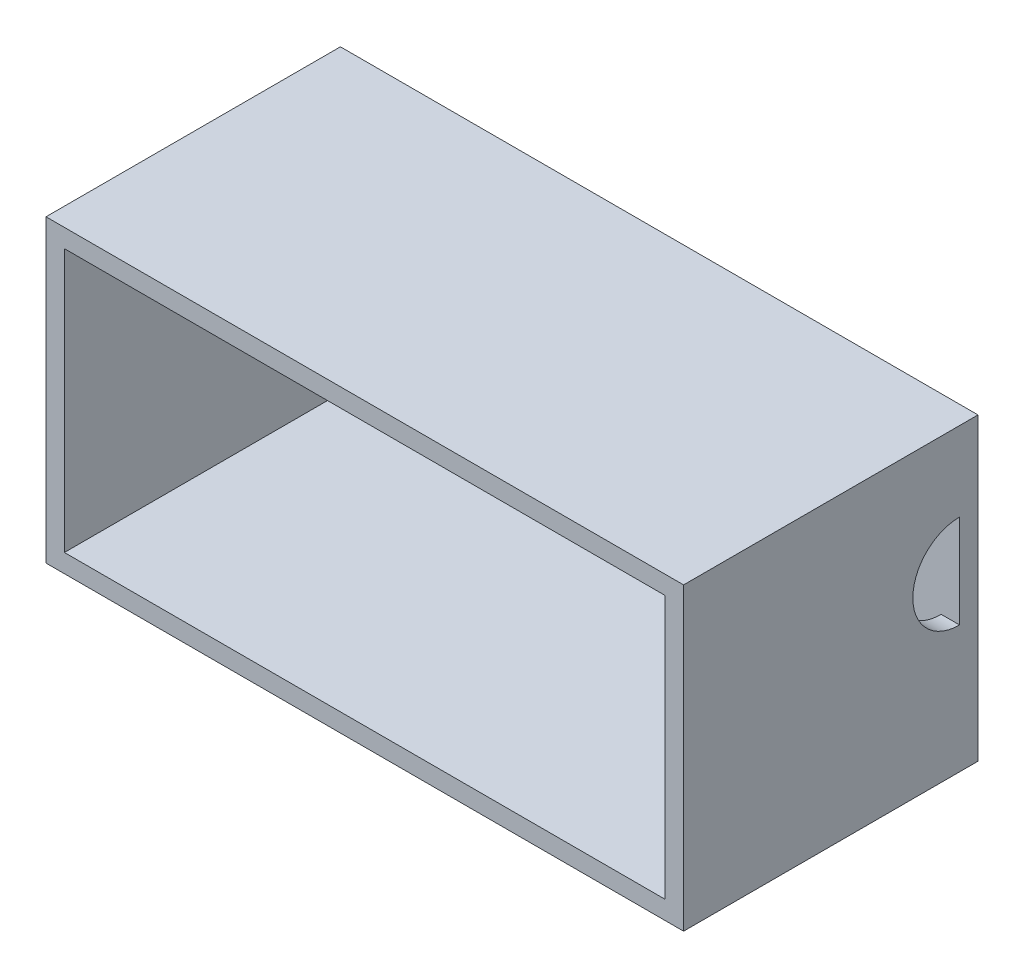
ISO-10303-21;
HEADER;
FILE_DESCRIPTION(('STEP AP214'),'2;1');
FILE_NAME('part.step','',(''),(''),'','','');
FILE_SCHEMA(('AUTOMOTIVE_DESIGN { 1 0 10303 214 1 1 1 1 }'));
ENDSEC;
DATA;
#1=APPLICATION_CONTEXT('core data for automotive mechanical design processes');
#2=APPLICATION_PROTOCOL_DEFINITION('international standard','automotive_design',2000,#1);
#3=PRODUCT_CONTEXT('',#1,'mechanical');
#4=PRODUCT('Part','Part','',(#3));
#5=PRODUCT_RELATED_PRODUCT_CATEGORY('part','',(#4));
#6=PRODUCT_DEFINITION_FORMATION('','',#4);
#7=PRODUCT_DEFINITION_CONTEXT('part definition',#1,'design');
#8=PRODUCT_DEFINITION('design','',#6,#7);
#9=PRODUCT_DEFINITION_SHAPE('','',#8);
#10=(LENGTH_UNIT() NAMED_UNIT(*) SI_UNIT(.MILLI.,.METRE.));
#11=(NAMED_UNIT(*) PLANE_ANGLE_UNIT() SI_UNIT($,.RADIAN.));
#12=(NAMED_UNIT(*) SI_UNIT($,.STERADIAN.) SOLID_ANGLE_UNIT());
#13=UNCERTAINTY_MEASURE_WITH_UNIT(LENGTH_MEASURE(1.E-05),#10,'distance_accuracy_value','');
#14=(GEOMETRIC_REPRESENTATION_CONTEXT(3) GLOBAL_UNCERTAINTY_ASSIGNED_CONTEXT((#13)) GLOBAL_UNIT_ASSIGNED_CONTEXT((#10,
#11,#12)) REPRESENTATION_CONTEXT('',''));
#15=CARTESIAN_POINT('',(0.,0.,0.));
#16=DIRECTION('',(0.,0.,1.));
#17=DIRECTION('',(1.,0.,0.));
#18=AXIS2_PLACEMENT_3D('',#15,#16,#17);
#19=CARTESIAN_POINT('',(0.,0.,30.));
#20=DIRECTION('',(0.,0.,1.));
#21=DIRECTION('',(1.,0.,0.));
#22=AXIS2_PLACEMENT_3D('',#19,#20,#21);
#23=PLANE('',#22);
#24=DIRECTION('',(0.,-1.,0.));
#25=VECTOR('',#24,1.);
#26=CARTESIAN_POINT('',(-26.415547341068,11.723595505618,30.));
#27=LINE('',#26,#25);
#28=CARTESIAN_POINT('',(-26.415547341068,11.723595505618,30.));
#29=VERTEX_POINT('',#28);
#30=CARTESIAN_POINT('',(-26.415547341068,-20.8764044943821,30.));
#31=VERTEX_POINT('',#30);
#32=EDGE_CURVE('E169',#29,#31,#27,.T.);
#33=ORIENTED_EDGE('',*,*,#32,.T.);
#34=DIRECTION('',(1.,0.,0.));
#35=VECTOR('',#34,1.);
#36=CARTESIAN_POINT('',(-26.415547341068,-20.8764044943821,30.));
#37=LINE('',#36,#35);
#38=CARTESIAN_POINT('',(42.884452658932,-20.8764044943821,30.));
#39=VERTEX_POINT('',#38);
#40=EDGE_CURVE('E172',#31,#39,#37,.T.);
#41=ORIENTED_EDGE('',*,*,#40,.T.);
#42=DIRECTION('',(0.,1.,0.));
#43=VECTOR('',#42,1.);
#44=CARTESIAN_POINT('',(42.884452658932,11.723595505618,30.));
#45=LINE('',#44,#43);
#46=CARTESIAN_POINT('',(42.884452658932,11.723595505618,30.));
#47=VERTEX_POINT('',#46);
#48=EDGE_CURVE('E174',#39,#47,#45,.T.);
#49=ORIENTED_EDGE('',*,*,#48,.T.);
#50=DIRECTION('',(-1.,0.,0.));
#51=VECTOR('',#50,1.);
#52=CARTESIAN_POINT('',(-26.415547341068,11.723595505618,30.));
#53=LINE('',#52,#51);
#54=EDGE_CURVE('E176',#47,#29,#53,.T.);
#55=ORIENTED_EDGE('',*,*,#54,.T.);
#56=EDGE_LOOP('',(#33,#41,#49,#55));
#57=FACE_BOUND('',#56,.T.);
#58=DIRECTION('',(1.,0.,0.));
#59=VECTOR('',#58,1.);
#60=CARTESIAN_POINT('',(-24.415547341068,-18.876404494382,30.));
#61=LINE('',#60,#59);
#62=CARTESIAN_POINT('',(-24.415547341068,-18.876404494382,30.));
#63=VERTEX_POINT('',#62);
#64=CARTESIAN_POINT('',(40.884452658932,-18.876404494382,30.));
#65=VERTEX_POINT('',#64);
#66=EDGE_CURVE('E215',#63,#65,#61,.T.);
#67=ORIENTED_EDGE('',*,*,#66,.F.);
#68=DIRECTION('',(0.,-1.,0.));
#69=VECTOR('',#68,1.);
#70=CARTESIAN_POINT('',(-24.415547341068,9.72359550561795,30.));
#71=LINE('',#70,#69);
#72=CARTESIAN_POINT('',(-24.415547341068,9.72359550561795,30.));
#73=VERTEX_POINT('',#72);
#74=EDGE_CURVE('E154',#73,#63,#71,.T.);
#75=ORIENTED_EDGE('',*,*,#74,.F.);
#76=DIRECTION('',(-1.,0.,0.));
#77=VECTOR('',#76,1.);
#78=CARTESIAN_POINT('',(-24.415547341068,9.72359550561795,30.));
#79=LINE('',#78,#77);
#80=CARTESIAN_POINT('',(40.884452658932,9.72359550561796,30.));
#81=VERTEX_POINT('',#80);
#82=EDGE_CURVE('E162',#81,#73,#79,.T.);
#83=ORIENTED_EDGE('',*,*,#82,.F.);
#84=DIRECTION('',(0.,1.,0.));
#85=VECTOR('',#84,1.);
#86=CARTESIAN_POINT('',(40.884452658932,9.72359550561796,30.));
#87=LINE('',#86,#85);
#88=EDGE_CURVE('E217',#65,#81,#87,.T.);
#89=ORIENTED_EDGE('',*,*,#88,.F.);
#90=EDGE_LOOP('',(#67,#75,#83,#89));
#91=FACE_BOUND('',#90,.T.);
#92=ADVANCED_FACE('F33',(#57,#91),#23,.T.);
#93=CARTESIAN_POINT('',(-26.415547341068,11.723595505618,30.));
#94=DIRECTION('',(1.,0.,0.));
#95=DIRECTION('',(0.,1.,0.));
#96=AXIS2_PLACEMENT_3D('',#93,#94,#95);
#97=PLANE('',#96);
#98=DIRECTION('',(0.,0.,-1.));
#99=VECTOR('',#98,1.);
#100=CARTESIAN_POINT('',(-26.415547341068,-13.276404494382,30.));
#101=LINE('',#100,#99);
#102=CARTESIAN_POINT('',(-26.415547341068,-13.276404494382,4.));
#103=VERTEX_POINT('',#102);
#104=CARTESIAN_POINT('',(-26.415547341068,-13.276404494382,0.));
#105=VERTEX_POINT('',#104);
#106=EDGE_CURVE('E207',#103,#105,#101,.T.);
#107=ORIENTED_EDGE('',*,*,#106,.T.);
#108=DIRECTION('',(0.,1.,0.));
#109=VECTOR('',#108,1.);
#110=CARTESIAN_POINT('',(-26.415547341068,11.723595505618,0.));
#111=LINE('',#110,#109);
#112=CARTESIAN_POINT('',(-26.415547341068,-0.276404494382045,0.));
#113=VERTEX_POINT('',#112);
#114=EDGE_CURVE('E204',#105,#113,#111,.T.);
#115=ORIENTED_EDGE('',*,*,#114,.T.);
#116=DIRECTION('',(0.,0.,1.));
#117=VECTOR('',#116,1.);
#118=CARTESIAN_POINT('',(-26.415547341068,-0.276404494382045,30.));
#119=LINE('',#118,#117);
#120=CARTESIAN_POINT('',(-26.415547341068,-0.276404494382045,4.));
#121=VERTEX_POINT('',#120);
#122=EDGE_CURVE('E257',#113,#121,#119,.T.);
#123=ORIENTED_EDGE('',*,*,#122,.T.);
#124=DIRECTION('',(0.,-1.,0.));
#125=VECTOR('',#124,1.);
#126=CARTESIAN_POINT('',(-26.415547341068,11.723595505618,4.));
#127=LINE('',#126,#125);
#128=EDGE_CURVE('E265',#121,#103,#127,.T.);
#129=ORIENTED_EDGE('',*,*,#128,.T.);
#130=EDGE_LOOP('',(#107,#115,#123,#129));
#131=FACE_BOUND('',#130,.T.);
#132=DIRECTION('',(0.,0.,-1.));
#133=VECTOR('',#132,1.);
#134=CARTESIAN_POINT('',(-26.415547341068,11.723595505618,30.));
#135=LINE('',#134,#133);
#136=CARTESIAN_POINT('',(-26.415547341068,11.723595505618,-2.));
#137=VERTEX_POINT('',#136);
#138=EDGE_CURVE('E178',#29,#137,#135,.T.);
#139=ORIENTED_EDGE('',*,*,#138,.T.);
#140=DIRECTION('',(0.,1.,0.));
#141=VECTOR('',#140,1.);
#142=CARTESIAN_POINT('',(-26.415547341068,11.723595505618,-2.));
#143=LINE('',#142,#141);
#144=CARTESIAN_POINT('',(-26.415547341068,-20.8764044943821,-2.));
#145=VERTEX_POINT('',#144);
#146=EDGE_CURVE('E198',#145,#137,#143,.T.);
#147=ORIENTED_EDGE('',*,*,#146,.F.);
#148=DIRECTION('',(0.,0.,-1.));
#149=VECTOR('',#148,1.);
#150=CARTESIAN_POINT('',(-26.415547341068,-20.8764044943821,30.));
#151=LINE('',#150,#149);
#152=EDGE_CURVE('E11',#31,#145,#151,.T.);
#153=ORIENTED_EDGE('',*,*,#152,.F.);
#154=ORIENTED_EDGE('',*,*,#32,.F.);
#155=EDGE_LOOP('',(#139,#147,#153,#154));
#156=FACE_BOUND('',#155,.T.);
#157=ADVANCED_FACE('F35',(#131,#156),#97,.F.);
#158=CARTESIAN_POINT('',(-26.415547341068,-20.8764044943821,30.));
#159=DIRECTION('',(0.,1.,0.));
#160=DIRECTION('',(0.,0.,1.));
#161=AXIS2_PLACEMENT_3D('',#158,#159,#160);
#162=PLANE('',#161);
#163=ORIENTED_EDGE('',*,*,#152,.T.);
#164=DIRECTION('',(-1.,0.,0.));
#165=VECTOR('',#164,1.);
#166=CARTESIAN_POINT('',(42.884452658932,-20.8764044943821,-2.));
#167=LINE('',#166,#165);
#168=CARTESIAN_POINT('',(42.884452658932,-20.8764044943821,-2.));
#169=VERTEX_POINT('',#168);
#170=EDGE_CURVE('E192',#169,#145,#167,.T.);
#171=ORIENTED_EDGE('',*,*,#170,.F.);
#172=DIRECTION('',(0.,0.,-1.));
#173=VECTOR('',#172,1.);
#174=CARTESIAN_POINT('',(42.884452658932,-20.8764044943821,30.));
#175=LINE('',#174,#173);
#176=EDGE_CURVE('E41',#39,#169,#175,.T.);
#177=ORIENTED_EDGE('',*,*,#176,.F.);
#178=ORIENTED_EDGE('',*,*,#40,.F.);
#179=EDGE_LOOP('',(#163,#171,#177,#178));
#180=FACE_BOUND('',#179,.T.);
#181=ADVANCED_FACE('F193',(#180),#162,.F.);
#182=CARTESIAN_POINT('',(42.884452658932,11.723595505618,30.));
#183=DIRECTION('',(-1.,0.,0.));
#184=DIRECTION('',(0.,0.,1.));
#185=AXIS2_PLACEMENT_3D('',#182,#183,#184);
#186=PLANE('',#185);
#187=DIRECTION('',(0.,-1.,0.));
#188=VECTOR('',#187,1.);
#189=CARTESIAN_POINT('',(42.884452658932,11.723595505618,0.));
#190=LINE('',#189,#188);
#191=CARTESIAN_POINT('',(42.884452658932,3.11129412181544,0.));
#192=VERTEX_POINT('',#191);
#193=CARTESIAN_POINT('',(42.884452658932,-7.0522569065563,0.));
#194=VERTEX_POINT('',#193);
#195=EDGE_CURVE('E135',#192,#194,#190,.T.);
#196=ORIENTED_EDGE('',*,*,#195,.T.);
#197=CARTESIAN_POINT('',(42.884452658932,-1.97048139237043,0.));
#198=DIRECTION('',(-1.,0.,0.));
#199=DIRECTION('',(0.,0.,1.));
#200=AXIS2_PLACEMENT_3D('',#197,#198,#199);
#201=CIRCLE('',#200,5.08177551418587);
#202=EDGE_CURVE('E133',#194,#192,#201,.T.);
#203=ORIENTED_EDGE('',*,*,#202,.T.);
#204=EDGE_LOOP('',(#196,#203));
#205=FACE_BOUND('',#204,.T.);
#206=ORIENTED_EDGE('',*,*,#176,.T.);
#207=DIRECTION('',(0.,-1.,0.));
#208=VECTOR('',#207,1.);
#209=CARTESIAN_POINT('',(42.884452658932,11.723595505618,-2.));
#210=LINE('',#209,#208);
#211=CARTESIAN_POINT('',(42.884452658932,11.723595505618,-2.));
#212=VERTEX_POINT('',#211);
#213=EDGE_CURVE('E189',#212,#169,#210,.T.);
#214=ORIENTED_EDGE('',*,*,#213,.F.);
#215=DIRECTION('',(0.,0.,-1.));
#216=VECTOR('',#215,1.);
#217=CARTESIAN_POINT('',(42.884452658932,11.723595505618,30.));
#218=LINE('',#217,#216);
#219=EDGE_CURVE('E180',#47,#212,#218,.T.);
#220=ORIENTED_EDGE('',*,*,#219,.F.);
#221=ORIENTED_EDGE('',*,*,#48,.F.);
#222=EDGE_LOOP('',(#206,#214,#220,#221));
#223=FACE_BOUND('',#222,.T.);
#224=ADVANCED_FACE('F186',(#205,#223),#186,.F.);
#225=CARTESIAN_POINT('',(-26.415547341068,11.723595505618,30.));
#226=DIRECTION('',(0.,-1.,0.));
#227=DIRECTION('',(1.,0.,0.));
#228=AXIS2_PLACEMENT_3D('',#225,#226,#227);
#229=PLANE('',#228);
#230=ORIENTED_EDGE('',*,*,#219,.T.);
#231=DIRECTION('',(1.,0.,0.));
#232=VECTOR('',#231,1.);
#233=CARTESIAN_POINT('',(42.884452658932,11.723595505618,-2.));
#234=LINE('',#233,#232);
#235=EDGE_CURVE('E203',#137,#212,#234,.T.);
#236=ORIENTED_EDGE('',*,*,#235,.F.);
#237=ORIENTED_EDGE('',*,*,#138,.F.);
#238=ORIENTED_EDGE('',*,*,#54,.F.);
#239=EDGE_LOOP('',(#230,#236,#237,#238));
#240=FACE_BOUND('',#239,.T.);
#241=ADVANCED_FACE('F298',(#240),#229,.F.);
#242=CARTESIAN_POINT('',(-24.415547341068,9.72359550561795,30.));
#243=DIRECTION('',(1.,0.,0.));
#244=DIRECTION('',(0.,1.,0.));
#245=AXIS2_PLACEMENT_3D('',#242,#243,#244);
#246=PLANE('',#245);
#247=DIRECTION('',(0.,0.,-1.));
#248=VECTOR('',#247,1.);
#249=CARTESIAN_POINT('',(-24.415547341068,-13.276404494382,0.));
#250=LINE('',#249,#248);
#251=CARTESIAN_POINT('',(-24.415547341068,-13.276404494382,4.));
#252=VERTEX_POINT('',#251);
#253=CARTESIAN_POINT('',(-24.415547341068,-13.276404494382,0.));
#254=VERTEX_POINT('',#253);
#255=EDGE_CURVE('E253',#252,#254,#250,.T.);
#256=ORIENTED_EDGE('',*,*,#255,.F.);
#257=DIRECTION('',(0.,-1.,0.));
#258=VECTOR('',#257,1.);
#259=CARTESIAN_POINT('',(-24.415547341068,-0.276404494382044,4.));
#260=LINE('',#259,#258);
#261=CARTESIAN_POINT('',(-24.415547341068,-0.276404494382044,4.));
#262=VERTEX_POINT('',#261);
#263=EDGE_CURVE('E250',#262,#252,#260,.T.);
#264=ORIENTED_EDGE('',*,*,#263,.F.);
#265=DIRECTION('',(0.,0.,1.));
#266=VECTOR('',#265,1.);
#267=CARTESIAN_POINT('',(-24.415547341068,-0.276404494382044,0.));
#268=LINE('',#267,#266);
#269=CARTESIAN_POINT('',(-24.415547341068,-0.276404494382044,0.));
#270=VERTEX_POINT('',#269);
#271=EDGE_CURVE('E247',#270,#262,#268,.T.);
#272=ORIENTED_EDGE('',*,*,#271,.F.);
#273=DIRECTION('',(0.,-1.,0.));
#274=VECTOR('',#273,1.);
#275=CARTESIAN_POINT('',(-24.415547341068,9.72359550561795,0.));
#276=LINE('',#275,#274);
#277=CARTESIAN_POINT('',(-24.415547341068,9.72359550561795,0.));
#278=VERTEX_POINT('',#277);
#279=EDGE_CURVE('E220',#278,#270,#276,.T.);
#280=ORIENTED_EDGE('',*,*,#279,.F.);
#281=DIRECTION('',(0.,0.,-1.));
#282=VECTOR('',#281,1.);
#283=CARTESIAN_POINT('',(-24.415547341068,9.72359550561795,30.));
#284=LINE('',#283,#282);
#285=EDGE_CURVE('E159',#73,#278,#284,.T.);
#286=ORIENTED_EDGE('',*,*,#285,.F.);
#287=ORIENTED_EDGE('',*,*,#74,.T.);
#288=DIRECTION('',(0.,0.,-1.));
#289=VECTOR('',#288,1.);
#290=CARTESIAN_POINT('',(-24.415547341068,-18.876404494382,30.));
#291=LINE('',#290,#289);
#292=CARTESIAN_POINT('',(-24.415547341068,-18.876404494382,0.));
#293=VERTEX_POINT('',#292);
#294=EDGE_CURVE('E166',#63,#293,#291,.T.);
#295=ORIENTED_EDGE('',*,*,#294,.T.);
#296=EDGE_CURVE('E213',#254,#293,#276,.T.);
#297=ORIENTED_EDGE('',*,*,#296,.F.);
#298=EDGE_LOOP('',(#256,#264,#272,#280,#286,#287,#295,#297));
#299=FACE_BOUND('',#298,.T.);
#300=ADVANCED_FACE('F234',(#299),#246,.T.);
#301=CARTESIAN_POINT('',(-24.415547341068,-18.876404494382,30.));
#302=DIRECTION('',(0.,1.,0.));
#303=DIRECTION('',(0.,0.,1.));
#304=AXIS2_PLACEMENT_3D('',#301,#302,#303);
#305=PLANE('',#304);
#306=DIRECTION('',(1.,0.,0.));
#307=VECTOR('',#306,1.);
#308=CARTESIAN_POINT('',(-24.415547341068,-18.876404494382,0.));
#309=LINE('',#308,#307);
#310=CARTESIAN_POINT('',(40.884452658932,-18.876404494382,0.));
#311=VERTEX_POINT('',#310);
#312=EDGE_CURVE('E151',#293,#311,#309,.T.);
#313=ORIENTED_EDGE('',*,*,#312,.F.);
#314=ORIENTED_EDGE('',*,*,#294,.F.);
#315=ORIENTED_EDGE('',*,*,#66,.T.);
#316=DIRECTION('',(0.,0.,-1.));
#317=VECTOR('',#316,1.);
#318=CARTESIAN_POINT('',(40.884452658932,-18.876404494382,30.));
#319=LINE('',#318,#317);
#320=EDGE_CURVE('E164',#65,#311,#319,.T.);
#321=ORIENTED_EDGE('',*,*,#320,.T.);
#322=EDGE_LOOP('',(#313,#314,#315,#321));
#323=FACE_BOUND('',#322,.T.);
#324=ADVANCED_FACE('F232',(#323),#305,.T.);
#325=CARTESIAN_POINT('',(40.884452658932,9.72359550561796,30.));
#326=DIRECTION('',(-1.,0.,0.));
#327=DIRECTION('',(0.,-1.,0.));
#328=AXIS2_PLACEMENT_3D('',#325,#326,#327);
#329=PLANE('',#328);
#330=CARTESIAN_POINT('',(40.884452658932,-1.97048139237043,0.));
#331=DIRECTION('',(-1.,0.,0.));
#332=DIRECTION('',(0.,0.,-1.));
#333=AXIS2_PLACEMENT_3D('',#330,#331,#332);
#334=CIRCLE('',#333,5.08177551418587);
#335=CARTESIAN_POINT('',(40.884452658932,-7.0522569065563,0.));
#336=VERTEX_POINT('',#335);
#337=CARTESIAN_POINT('',(40.884452658932,3.11129412181544,0.));
#338=VERTEX_POINT('',#337);
#339=EDGE_CURVE('E55',#336,#338,#334,.T.);
#340=ORIENTED_EDGE('',*,*,#339,.F.);
#341=DIRECTION('',(0.,1.,0.));
#342=VECTOR('',#341,1.);
#343=CARTESIAN_POINT('',(40.884452658932,9.72359550561796,0.));
#344=LINE('',#343,#342);
#345=EDGE_CURVE('E143',#311,#336,#344,.T.);
#346=ORIENTED_EDGE('',*,*,#345,.F.);
#347=ORIENTED_EDGE('',*,*,#320,.F.);
#348=ORIENTED_EDGE('',*,*,#88,.T.);
#349=DIRECTION('',(0.,0.,-1.));
#350=VECTOR('',#349,1.);
#351=CARTESIAN_POINT('',(40.884452658932,9.72359550561796,30.));
#352=LINE('',#351,#350);
#353=CARTESIAN_POINT('',(40.884452658932,9.72359550561796,0.));
#354=VERTEX_POINT('',#353);
#355=EDGE_CURVE('E161',#81,#354,#352,.T.);
#356=ORIENTED_EDGE('',*,*,#355,.T.);
#357=EDGE_CURVE('E146',#338,#354,#344,.T.);
#358=ORIENTED_EDGE('',*,*,#357,.F.);
#359=EDGE_LOOP('',(#340,#346,#347,#348,#356,#358));
#360=FACE_BOUND('',#359,.T.);
#361=ADVANCED_FACE('F141',(#360),#329,.T.);
#362=CARTESIAN_POINT('',(-24.415547341068,9.72359550561795,30.));
#363=DIRECTION('',(0.,-1.,0.));
#364=DIRECTION('',(1.,0.,0.));
#365=AXIS2_PLACEMENT_3D('',#362,#363,#364);
#366=PLANE('',#365);
#367=DIRECTION('',(-1.,0.,0.));
#368=VECTOR('',#367,1.);
#369=CARTESIAN_POINT('',(-24.415547341068,9.72359550561795,0.));
#370=LINE('',#369,#368);
#371=EDGE_CURVE('E152',#354,#278,#370,.T.);
#372=ORIENTED_EDGE('',*,*,#371,.F.);
#373=ORIENTED_EDGE('',*,*,#355,.F.);
#374=ORIENTED_EDGE('',*,*,#82,.T.);
#375=ORIENTED_EDGE('',*,*,#285,.T.);
#376=EDGE_LOOP('',(#372,#373,#374,#375));
#377=FACE_BOUND('',#376,.T.);
#378=ADVANCED_FACE('F242',(#377),#366,.T.);
#379=CARTESIAN_POINT('',(0.,0.,0.));
#380=DIRECTION('',(0.,0.,-1.));
#381=DIRECTION('',(-1.,0.,0.));
#382=AXIS2_PLACEMENT_3D('',#379,#380,#381);
#383=PLANE('',#382);
#384=ORIENTED_EDGE('',*,*,#371,.T.);
#385=ORIENTED_EDGE('',*,*,#279,.T.);
#386=DIRECTION('',(1.,0.,0.));
#387=VECTOR('',#386,1.);
#388=CARTESIAN_POINT('',(-42.415547341068,-0.276404494382049,0.));
#389=LINE('',#388,#387);
#390=EDGE_CURVE('E255',#113,#270,#389,.T.);
#391=ORIENTED_EDGE('',*,*,#390,.F.);
#392=ORIENTED_EDGE('',*,*,#114,.F.);
#393=DIRECTION('',(1.,0.,0.));
#394=VECTOR('',#393,1.);
#395=CARTESIAN_POINT('',(-42.415547341068,-13.276404494382,0.));
#396=LINE('',#395,#394);
#397=EDGE_CURVE('E227',#105,#254,#396,.T.);
#398=ORIENTED_EDGE('',*,*,#397,.T.);
#399=ORIENTED_EDGE('',*,*,#296,.T.);
#400=ORIENTED_EDGE('',*,*,#312,.T.);
#401=ORIENTED_EDGE('',*,*,#345,.T.);
#402=DIRECTION('',(-1.,0.,0.));
#403=VECTOR('',#402,1.);
#404=CARTESIAN_POINT('',(58.884452658932,-7.0522569065563,0.));
#405=LINE('',#404,#403);
#406=EDGE_CURVE('E48',#194,#336,#405,.T.);
#407=ORIENTED_EDGE('',*,*,#406,.F.);
#408=ORIENTED_EDGE('',*,*,#195,.F.);
#409=DIRECTION('',(-1.,0.,0.));
#410=VECTOR('',#409,1.);
#411=CARTESIAN_POINT('',(58.884452658932,3.11129412181544,0.));
#412=LINE('',#411,#410);
#413=EDGE_CURVE('E136',#192,#338,#412,.T.);
#414=ORIENTED_EDGE('',*,*,#413,.T.);
#415=ORIENTED_EDGE('',*,*,#357,.T.);
#416=EDGE_LOOP('',(#384,#385,#391,#392,#398,#399,#400,#401,#407,#408,#414,#415));
#417=FACE_BOUND('',#416,.T.);
#418=ADVANCED_FACE('F149',(#417),#383,.F.);
#419=CARTESIAN_POINT('',(0.,0.,-2.));
#420=DIRECTION('',(0.,0.,-1.));
#421=DIRECTION('',(-1.,0.,0.));
#422=AXIS2_PLACEMENT_3D('',#419,#420,#421);
#423=PLANE('',#422);
#424=ORIENTED_EDGE('',*,*,#213,.T.);
#425=ORIENTED_EDGE('',*,*,#170,.T.);
#426=ORIENTED_EDGE('',*,*,#146,.T.);
#427=ORIENTED_EDGE('',*,*,#235,.T.);
#428=EDGE_LOOP('',(#424,#425,#426,#427));
#429=FACE_BOUND('',#428,.T.);
#430=ADVANCED_FACE('F201',(#429),#423,.T.);
#431=CARTESIAN_POINT('',(-42.415547341068,-13.276404494382,0.));
#432=DIRECTION('',(0.,-1.,0.));
#433=DIRECTION('',(1.,0.,0.));
#434=AXIS2_PLACEMENT_3D('',#431,#432,#433);
#435=PLANE('',#434);
#436=DIRECTION('',(1.,0.,0.));
#437=VECTOR('',#436,1.);
#438=CARTESIAN_POINT('',(-42.415547341068,-13.276404494382,4.));
#439=LINE('',#438,#437);
#440=EDGE_CURVE('E258',#103,#252,#439,.T.);
#441=ORIENTED_EDGE('',*,*,#440,.T.);
#442=ORIENTED_EDGE('',*,*,#255,.T.);
#443=ORIENTED_EDGE('',*,*,#397,.F.);
#444=ORIENTED_EDGE('',*,*,#106,.F.);
#445=EDGE_LOOP('',(#441,#442,#443,#444));
#446=FACE_BOUND('',#445,.T.);
#447=ADVANCED_FACE('F273',(#446),#435,.F.);
#448=CARTESIAN_POINT('',(-42.415547341068,-0.276404494382049,4.));
#449=DIRECTION('',(0.,0.,1.));
#450=DIRECTION('',(0.,-1.,0.));
#451=AXIS2_PLACEMENT_3D('',#448,#449,#450);
#452=PLANE('',#451);
#453=DIRECTION('',(1.,0.,0.));
#454=VECTOR('',#453,1.);
#455=CARTESIAN_POINT('',(-42.415547341068,-0.276404494382049,4.));
#456=LINE('',#455,#454);
#457=EDGE_CURVE('E260',#121,#262,#456,.T.);
#458=ORIENTED_EDGE('',*,*,#457,.T.);
#459=ORIENTED_EDGE('',*,*,#263,.T.);
#460=ORIENTED_EDGE('',*,*,#440,.F.);
#461=ORIENTED_EDGE('',*,*,#128,.F.);
#462=EDGE_LOOP('',(#458,#459,#460,#461));
#463=FACE_BOUND('',#462,.T.);
#464=ADVANCED_FACE('F275',(#463),#452,.F.);
#465=CARTESIAN_POINT('',(-42.415547341068,-0.276404494382049,0.));
#466=DIRECTION('',(0.,1.,0.));
#467=DIRECTION('',(-1.,0.,0.));
#468=AXIS2_PLACEMENT_3D('',#465,#466,#467);
#469=PLANE('',#468);
#470=ORIENTED_EDGE('',*,*,#390,.T.);
#471=ORIENTED_EDGE('',*,*,#271,.T.);
#472=ORIENTED_EDGE('',*,*,#457,.F.);
#473=ORIENTED_EDGE('',*,*,#122,.F.);
#474=EDGE_LOOP('',(#470,#471,#472,#473));
#475=FACE_BOUND('',#474,.T.);
#476=ADVANCED_FACE('F279',(#475),#469,.F.);
#477=CARTESIAN_POINT('',(58.884452658932,-1.97048139237043,0.));
#478=DIRECTION('',(-1.,0.,0.));
#479=DIRECTION('',(0.,0.,1.));
#480=AXIS2_PLACEMENT_3D('',#477,#478,#479);
#481=CYLINDRICAL_SURFACE('',#480,5.08177551418587);
#482=ORIENTED_EDGE('',*,*,#406,.T.);
#483=ORIENTED_EDGE('',*,*,#339,.T.);
#484=ORIENTED_EDGE('',*,*,#413,.F.);
#485=ORIENTED_EDGE('',*,*,#202,.F.);
#486=EDGE_LOOP('',(#482,#483,#484,#485));
#487=FACE_BOUND('',#486,.T.);
#488=ADVANCED_FACE('F131',(#487),#481,.F.);
#489=CLOSED_SHELL('',(#92,#157,#181,#224,#241,#300,#324,#361,#378,#418,#430,#447,#464,#476,#488));
#490=MANIFOLD_SOLID_BREP('B2',#489);
#491=ADVANCED_BREP_SHAPE_REPRESENTATION('',(#18,#490),#14);
#492=SHAPE_DEFINITION_REPRESENTATION(#9,#491);
ENDSEC;
END-ISO-10303-21;
